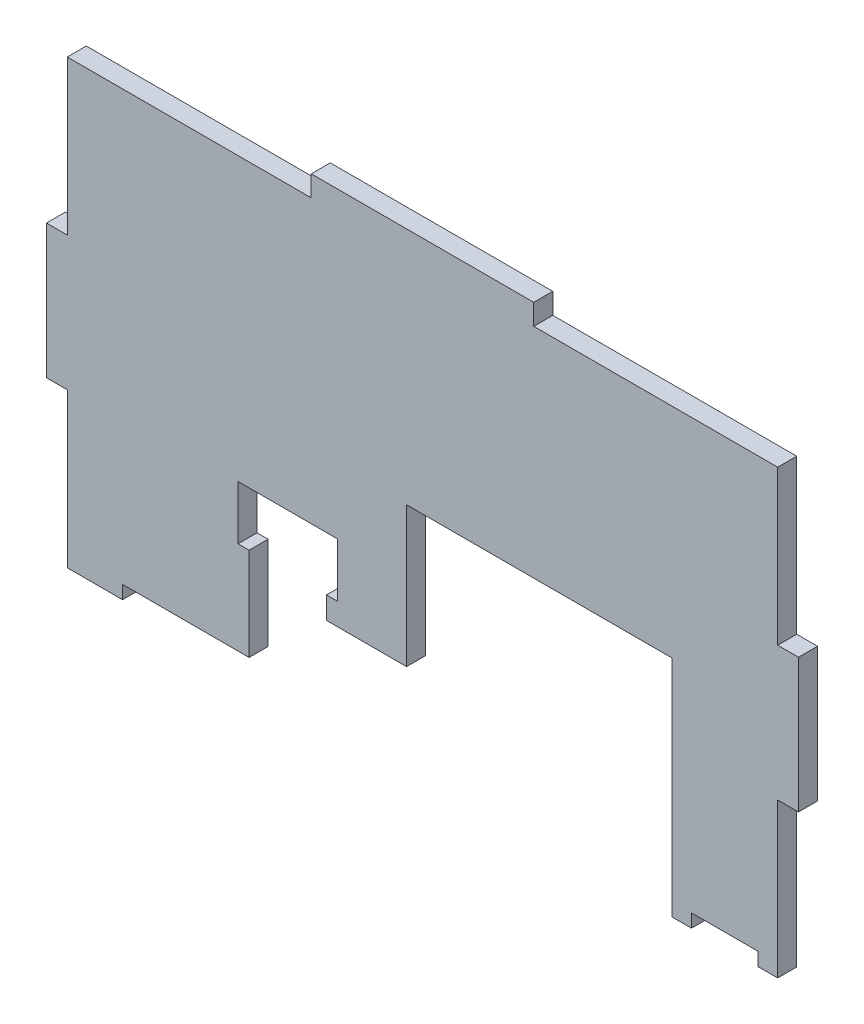
ISO-10303-21;
HEADER;
FILE_DESCRIPTION(('STEP AP214'),'2;1');
FILE_NAME('part.step','',(''),(''),'','','');
FILE_SCHEMA(('AUTOMOTIVE_DESIGN { 1 0 10303 214 1 1 1 1 }'));
ENDSEC;
DATA;
#1=APPLICATION_CONTEXT('core data for automotive mechanical design processes');
#2=APPLICATION_PROTOCOL_DEFINITION('international standard','automotive_design',2000,#1);
#3=PRODUCT_CONTEXT('',#1,'mechanical');
#4=PRODUCT('Part','Part','',(#3));
#5=PRODUCT_RELATED_PRODUCT_CATEGORY('part','',(#4));
#6=PRODUCT_DEFINITION_FORMATION('','',#4);
#7=PRODUCT_DEFINITION_CONTEXT('part definition',#1,'design');
#8=PRODUCT_DEFINITION('design','',#6,#7);
#9=PRODUCT_DEFINITION_SHAPE('','',#8);
#10=(LENGTH_UNIT() NAMED_UNIT(*) SI_UNIT(.MILLI.,.METRE.));
#11=(NAMED_UNIT(*) PLANE_ANGLE_UNIT() SI_UNIT($,.RADIAN.));
#12=(NAMED_UNIT(*) SI_UNIT($,.STERADIAN.) SOLID_ANGLE_UNIT());
#13=UNCERTAINTY_MEASURE_WITH_UNIT(LENGTH_MEASURE(1.E-05),#10,'distance_accuracy_value','');
#14=(GEOMETRIC_REPRESENTATION_CONTEXT(3) GLOBAL_UNCERTAINTY_ASSIGNED_CONTEXT((#13)) GLOBAL_UNIT_ASSIGNED_CONTEXT((#10,
#11,#12)) REPRESENTATION_CONTEXT('',''));
#15=CARTESIAN_POINT('',(0.,0.,0.));
#16=DIRECTION('',(0.,0.,1.));
#17=DIRECTION('',(1.,0.,0.));
#18=AXIS2_PLACEMENT_3D('',#15,#16,#17);
#19=CARTESIAN_POINT('',(0.,3.,4.3));
#20=DIRECTION('',(0.,1.,0.));
#21=DIRECTION('',(-1.,0.,0.));
#22=AXIS2_PLACEMENT_3D('',#19,#20,#21);
#23=PLANE('',#22);
#24=DIRECTION('',(1.,0.,0.));
#25=VECTOR('',#24,1.);
#26=CARTESIAN_POINT('',(0.,3.,0.));
#27=LINE('',#26,#25);
#28=CARTESIAN_POINT('',(12.5,3.,0.));
#29=VERTEX_POINT('',#28);
#30=CARTESIAN_POINT('',(41.0999999999999,3.,0.));
#31=VERTEX_POINT('',#30);
#32=EDGE_CURVE('E300',#29,#31,#27,.T.);
#33=ORIENTED_EDGE('',*,*,#32,.T.);
#34=DIRECTION('',(0.,0.,-1.));
#35=VECTOR('',#34,1.);
#36=CARTESIAN_POINT('',(41.0999999999999,3.,4.3));
#37=LINE('',#36,#35);
#38=CARTESIAN_POINT('',(41.0999999999999,3.,4.3));
#39=VERTEX_POINT('',#38);
#40=EDGE_CURVE('E11',#39,#31,#37,.T.);
#41=ORIENTED_EDGE('',*,*,#40,.F.);
#42=DIRECTION('',(1.,0.,0.));
#43=VECTOR('',#42,1.);
#44=CARTESIAN_POINT('',(0.,3.,4.3));
#45=LINE('',#44,#43);
#46=CARTESIAN_POINT('',(12.5,3.,4.3));
#47=VERTEX_POINT('',#46);
#48=EDGE_CURVE('E175',#47,#39,#45,.T.);
#49=ORIENTED_EDGE('',*,*,#48,.F.);
#50=DIRECTION('',(0.,0.,-1.));
#51=VECTOR('',#50,1.);
#52=CARTESIAN_POINT('',(12.5,3.,4.3));
#53=LINE('',#52,#51);
#54=EDGE_CURVE('E299',#47,#29,#53,.T.);
#55=ORIENTED_EDGE('',*,*,#54,.T.);
#56=EDGE_LOOP('',(#33,#41,#49,#55));
#57=FACE_BOUND('',#56,.T.);
#58=ADVANCED_FACE('F41',(#57),#23,.F.);
#59=CARTESIAN_POINT('',(41.0999999999999,0.,4.3));
#60=DIRECTION('',(1.,0.,0.));
#61=DIRECTION('',(0.,0.,-1.));
#62=AXIS2_PLACEMENT_3D('',#59,#60,#61);
#63=PLANE('',#62);
#64=DIRECTION('',(0.,-1.,0.));
#65=VECTOR('',#64,1.);
#66=CARTESIAN_POINT('',(41.0999999999999,0.,0.));
#67=LINE('',#66,#65);
#68=CARTESIAN_POINT('',(41.0999999999999,24.,0.));
#69=VERTEX_POINT('',#68);
#70=EDGE_CURVE('E304',#69,#31,#67,.T.);
#71=ORIENTED_EDGE('',*,*,#70,.F.);
#72=DIRECTION('',(0.,0.,-1.));
#73=VECTOR('',#72,1.);
#74=CARTESIAN_POINT('',(41.0999999999999,24.,4.3));
#75=LINE('',#74,#73);
#76=CARTESIAN_POINT('',(41.0999999999999,24.,4.3));
#77=VERTEX_POINT('',#76);
#78=EDGE_CURVE('E50',#77,#69,#75,.T.);
#79=ORIENTED_EDGE('',*,*,#78,.F.);
#80=DIRECTION('',(0.,-1.,0.));
#81=VECTOR('',#80,1.);
#82=CARTESIAN_POINT('',(41.0999999999999,0.,4.3));
#83=LINE('',#82,#81);
#84=EDGE_CURVE('E1045',#77,#39,#83,.T.);
#85=ORIENTED_EDGE('',*,*,#84,.T.);
#86=ORIENTED_EDGE('',*,*,#40,.T.);
#87=EDGE_LOOP('',(#71,#79,#85,#86));
#88=FACE_BOUND('',#87,.T.);
#89=ADVANCED_FACE('F529',(#88),#63,.T.);
#90=CARTESIAN_POINT('',(0.,24.,4.3));
#91=DIRECTION('',(0.,1.,0.));
#92=DIRECTION('',(0.,0.,1.));
#93=AXIS2_PLACEMENT_3D('',#90,#91,#92);
#94=PLANE('',#93);
#95=DIRECTION('',(1.,0.,0.));
#96=VECTOR('',#95,1.);
#97=CARTESIAN_POINT('',(0.,24.,0.));
#98=LINE('',#97,#96);
#99=CARTESIAN_POINT('',(38.5999999999999,24.,0.));
#100=VERTEX_POINT('',#99);
#101=EDGE_CURVE('E308',#100,#69,#98,.T.);
#102=ORIENTED_EDGE('',*,*,#101,.F.);
#103=DIRECTION('',(0.,0.,-1.));
#104=VECTOR('',#103,1.);
#105=CARTESIAN_POINT('',(38.5999999999999,24.,4.3));
#106=LINE('',#105,#104);
#107=CARTESIAN_POINT('',(38.5999999999999,24.,4.3));
#108=VERTEX_POINT('',#107);
#109=EDGE_CURVE('E517',#108,#100,#106,.T.);
#110=ORIENTED_EDGE('',*,*,#109,.F.);
#111=DIRECTION('',(1.,0.,0.));
#112=VECTOR('',#111,1.);
#113=CARTESIAN_POINT('',(0.,24.,4.3));
#114=LINE('',#113,#112);
#115=EDGE_CURVE('E526',#108,#77,#114,.T.);
#116=ORIENTED_EDGE('',*,*,#115,.T.);
#117=ORIENTED_EDGE('',*,*,#78,.T.);
#118=EDGE_LOOP('',(#102,#110,#116,#117));
#119=FACE_BOUND('',#118,.T.);
#120=ADVANCED_FACE('F524',(#119),#94,.T.);
#121=CARTESIAN_POINT('',(38.5999999999999,0.,4.3));
#122=DIRECTION('',(-1.,0.,0.));
#123=DIRECTION('',(0.,0.,1.));
#124=AXIS2_PLACEMENT_3D('',#121,#122,#123);
#125=PLANE('',#124);
#126=DIRECTION('',(0.,1.,0.));
#127=VECTOR('',#126,1.);
#128=CARTESIAN_POINT('',(38.5999999999999,0.,0.));
#129=LINE('',#128,#127);
#130=CARTESIAN_POINT('',(38.5999999999999,36.2,0.));
#131=VERTEX_POINT('',#130);
#132=EDGE_CURVE('E312',#100,#131,#129,.T.);
#133=ORIENTED_EDGE('',*,*,#132,.T.);
#134=DIRECTION('',(0.,0.,-1.));
#135=VECTOR('',#134,1.);
#136=CARTESIAN_POINT('',(38.5999999999999,36.2,4.3));
#137=LINE('',#136,#135);
#138=CARTESIAN_POINT('',(38.5999999999999,36.2,4.3));
#139=VERTEX_POINT('',#138);
#140=EDGE_CURVE('E513',#139,#131,#137,.T.);
#141=ORIENTED_EDGE('',*,*,#140,.F.);
#142=DIRECTION('',(0.,1.,0.));
#143=VECTOR('',#142,1.);
#144=CARTESIAN_POINT('',(38.5999999999999,0.,4.3));
#145=LINE('',#144,#143);
#146=EDGE_CURVE('E548',#108,#139,#145,.T.);
#147=ORIENTED_EDGE('',*,*,#146,.F.);
#148=ORIENTED_EDGE('',*,*,#109,.T.);
#149=EDGE_LOOP('',(#133,#141,#147,#148));
#150=FACE_BOUND('',#149,.T.);
#151=ADVANCED_FACE('F537',(#150),#125,.F.);
#152=CARTESIAN_POINT('',(0.,36.2,4.3));
#153=DIRECTION('',(0.,1.,0.));
#154=DIRECTION('',(0.,0.,1.));
#155=AXIS2_PLACEMENT_3D('',#152,#153,#154);
#156=PLANE('',#155);
#157=DIRECTION('',(1.,0.,0.));
#158=VECTOR('',#157,1.);
#159=CARTESIAN_POINT('',(0.,36.2,0.));
#160=LINE('',#159,#158);
#161=CARTESIAN_POINT('',(61.0999999999999,36.2,0.));
#162=VERTEX_POINT('',#161);
#163=EDGE_CURVE('E315',#131,#162,#160,.T.);
#164=ORIENTED_EDGE('',*,*,#163,.T.);
#165=DIRECTION('',(0.,0.,-1.));
#166=VECTOR('',#165,1.);
#167=CARTESIAN_POINT('',(61.0999999999999,36.2,4.3));
#168=LINE('',#167,#166);
#169=CARTESIAN_POINT('',(61.0999999999999,36.2,4.3));
#170=VERTEX_POINT('',#169);
#171=EDGE_CURVE('E510',#170,#162,#168,.T.);
#172=ORIENTED_EDGE('',*,*,#171,.F.);
#173=DIRECTION('',(1.,0.,0.));
#174=VECTOR('',#173,1.);
#175=CARTESIAN_POINT('',(0.,36.2,4.3));
#176=LINE('',#175,#174);
#177=EDGE_CURVE('E543',#139,#170,#176,.T.);
#178=ORIENTED_EDGE('',*,*,#177,.F.);
#179=ORIENTED_EDGE('',*,*,#140,.T.);
#180=EDGE_LOOP('',(#164,#172,#178,#179));
#181=FACE_BOUND('',#180,.T.);
#182=ADVANCED_FACE('F541',(#181),#156,.F.);
#183=CARTESIAN_POINT('',(61.0999999999999,0.,4.3));
#184=DIRECTION('',(-1.,0.,0.));
#185=DIRECTION('',(0.,0.,1.));
#186=AXIS2_PLACEMENT_3D('',#183,#184,#185);
#187=PLANE('',#186);
#188=DIRECTION('',(0.,1.,0.));
#189=VECTOR('',#188,1.);
#190=CARTESIAN_POINT('',(61.0999999999999,0.,0.));
#191=LINE('',#190,#189);
#192=CARTESIAN_POINT('',(61.0999999999999,24.,0.));
#193=VERTEX_POINT('',#192);
#194=EDGE_CURVE('E319',#193,#162,#191,.T.);
#195=ORIENTED_EDGE('',*,*,#194,.F.);
#196=DIRECTION('',(0.,0.,-1.));
#197=VECTOR('',#196,1.);
#198=CARTESIAN_POINT('',(61.0999999999999,24.,4.3));
#199=LINE('',#198,#197);
#200=CARTESIAN_POINT('',(61.0999999999999,24.,4.3));
#201=VERTEX_POINT('',#200);
#202=EDGE_CURVE('E507',#201,#193,#199,.T.);
#203=ORIENTED_EDGE('',*,*,#202,.F.);
#204=DIRECTION('',(0.,1.,0.));
#205=VECTOR('',#204,1.);
#206=CARTESIAN_POINT('',(61.0999999999999,0.,4.3));
#207=LINE('',#206,#205);
#208=EDGE_CURVE('E547',#201,#170,#207,.T.);
#209=ORIENTED_EDGE('',*,*,#208,.T.);
#210=ORIENTED_EDGE('',*,*,#171,.T.);
#211=EDGE_LOOP('',(#195,#203,#209,#210));
#212=FACE_BOUND('',#211,.T.);
#213=ADVANCED_FACE('F934',(#212),#187,.T.);
#214=CARTESIAN_POINT('',(0.,24.,4.3));
#215=DIRECTION('',(0.,-1.,0.));
#216=DIRECTION('',(0.,0.,-1.));
#217=AXIS2_PLACEMENT_3D('',#214,#215,#216);
#218=PLANE('',#217);
#219=DIRECTION('',(-1.,0.,0.));
#220=VECTOR('',#219,1.);
#221=CARTESIAN_POINT('',(0.,24.,0.));
#222=LINE('',#221,#220);
#223=CARTESIAN_POINT('',(58.5999999999999,24.,0.));
#224=VERTEX_POINT('',#223);
#225=EDGE_CURVE('E323',#193,#224,#222,.T.);
#226=ORIENTED_EDGE('',*,*,#225,.T.);
#227=DIRECTION('',(0.,0.,-1.));
#228=VECTOR('',#227,1.);
#229=CARTESIAN_POINT('',(58.5999999999999,24.,4.3));
#230=LINE('',#229,#228);
#231=CARTESIAN_POINT('',(58.5999999999999,24.,4.3));
#232=VERTEX_POINT('',#231);
#233=EDGE_CURVE('E503',#232,#224,#230,.T.);
#234=ORIENTED_EDGE('',*,*,#233,.F.);
#235=DIRECTION('',(-1.,0.,0.));
#236=VECTOR('',#235,1.);
#237=CARTESIAN_POINT('',(0.,24.,4.3));
#238=LINE('',#237,#236);
#239=EDGE_CURVE('E552',#201,#232,#238,.T.);
#240=ORIENTED_EDGE('',*,*,#239,.F.);
#241=ORIENTED_EDGE('',*,*,#202,.T.);
#242=EDGE_LOOP('',(#226,#234,#240,#241));
#243=FACE_BOUND('',#242,.T.);
#244=ADVANCED_FACE('F924',(#243),#218,.F.);
#245=CARTESIAN_POINT('',(58.5999999999999,0.,4.3));
#246=DIRECTION('',(1.,0.,0.));
#247=DIRECTION('',(0.,0.,-1.));
#248=AXIS2_PLACEMENT_3D('',#245,#246,#247);
#249=PLANE('',#248);
#250=DIRECTION('',(0.,-1.,0.));
#251=VECTOR('',#250,1.);
#252=CARTESIAN_POINT('',(58.5999999999999,0.,0.));
#253=LINE('',#252,#251);
#254=CARTESIAN_POINT('',(58.5999999999999,19.,0.));
#255=VERTEX_POINT('',#254);
#256=EDGE_CURVE('E326',#224,#255,#253,.T.);
#257=ORIENTED_EDGE('',*,*,#256,.T.);
#258=DIRECTION('',(0.,0.,-1.));
#259=VECTOR('',#258,1.);
#260=CARTESIAN_POINT('',(58.5999999999999,19.,4.3));
#261=LINE('',#260,#259);
#262=CARTESIAN_POINT('',(58.5999999999999,19.,4.3));
#263=VERTEX_POINT('',#262);
#264=EDGE_CURVE('E500',#263,#255,#261,.T.);
#265=ORIENTED_EDGE('',*,*,#264,.F.);
#266=DIRECTION('',(0.,-1.,0.));
#267=VECTOR('',#266,1.);
#268=CARTESIAN_POINT('',(58.5999999999999,0.,4.3));
#269=LINE('',#268,#267);
#270=EDGE_CURVE('E559',#232,#263,#269,.T.);
#271=ORIENTED_EDGE('',*,*,#270,.F.);
#272=ORIENTED_EDGE('',*,*,#233,.T.);
#273=EDGE_LOOP('',(#257,#265,#271,#272));
#274=FACE_BOUND('',#273,.T.);
#275=ADVANCED_FACE('F913',(#274),#249,.F.);
#276=CARTESIAN_POINT('',(0.,19.,4.3));
#277=DIRECTION('',(0.,-1.,0.));
#278=DIRECTION('',(0.,0.,-1.));
#279=AXIS2_PLACEMENT_3D('',#276,#277,#278);
#280=PLANE('',#279);
#281=DIRECTION('',(-1.,0.,0.));
#282=VECTOR('',#281,1.);
#283=CARTESIAN_POINT('',(0.,19.,0.));
#284=LINE('',#283,#282);
#285=CARTESIAN_POINT('',(76.6999999999999,19.,0.));
#286=VERTEX_POINT('',#285);
#287=EDGE_CURVE('E330',#286,#255,#284,.T.);
#288=ORIENTED_EDGE('',*,*,#287,.F.);
#289=DIRECTION('',(0.,0.,-1.));
#290=VECTOR('',#289,1.);
#291=CARTESIAN_POINT('',(76.6999999999999,19.,4.3));
#292=LINE('',#291,#290);
#293=CARTESIAN_POINT('',(76.6999999999999,19.,4.3));
#294=VERTEX_POINT('',#293);
#295=EDGE_CURVE('E497',#294,#286,#292,.T.);
#296=ORIENTED_EDGE('',*,*,#295,.F.);
#297=DIRECTION('',(-1.,0.,0.));
#298=VECTOR('',#297,1.);
#299=CARTESIAN_POINT('',(0.,19.,4.3));
#300=LINE('',#299,#298);
#301=EDGE_CURVE('E562',#294,#263,#300,.T.);
#302=ORIENTED_EDGE('',*,*,#301,.T.);
#303=ORIENTED_EDGE('',*,*,#264,.T.);
#304=EDGE_LOOP('',(#288,#296,#302,#303));
#305=FACE_BOUND('',#304,.T.);
#306=ADVANCED_FACE('F903',(#305),#280,.T.);
#307=CARTESIAN_POINT('',(76.6999999999999,0.,4.3));
#308=DIRECTION('',(-1.,0.,0.));
#309=DIRECTION('',(0.,0.,1.));
#310=AXIS2_PLACEMENT_3D('',#307,#308,#309);
#311=PLANE('',#310);
#312=DIRECTION('',(0.,1.,0.));
#313=VECTOR('',#312,1.);
#314=CARTESIAN_POINT('',(76.6999999999999,0.,0.));
#315=LINE('',#314,#313);
#316=CARTESIAN_POINT('',(76.6999999999999,50.7,0.));
#317=VERTEX_POINT('',#316);
#318=EDGE_CURVE('E334',#286,#317,#315,.T.);
#319=ORIENTED_EDGE('',*,*,#318,.T.);
#320=DIRECTION('',(0.,0.,-1.));
#321=VECTOR('',#320,1.);
#322=CARTESIAN_POINT('',(76.6999999999999,50.7,4.3));
#323=LINE('',#322,#321);
#324=CARTESIAN_POINT('',(76.6999999999999,50.7,4.3));
#325=VERTEX_POINT('',#324);
#326=EDGE_CURVE('E493',#325,#317,#323,.T.);
#327=ORIENTED_EDGE('',*,*,#326,.F.);
#328=DIRECTION('',(0.,1.,0.));
#329=VECTOR('',#328,1.);
#330=CARTESIAN_POINT('',(76.6999999999999,0.,4.3));
#331=LINE('',#330,#329);
#332=EDGE_CURVE('E566',#294,#325,#331,.T.);
#333=ORIENTED_EDGE('',*,*,#332,.F.);
#334=ORIENTED_EDGE('',*,*,#295,.T.);
#335=EDGE_LOOP('',(#319,#327,#333,#334));
#336=FACE_BOUND('',#335,.T.);
#337=ADVANCED_FACE('F893',(#336),#311,.F.);
#338=CARTESIAN_POINT('',(0.,50.7,4.3));
#339=DIRECTION('',(0.,1.,0.));
#340=DIRECTION('',(0.,0.,1.));
#341=AXIS2_PLACEMENT_3D('',#338,#339,#340);
#342=PLANE('',#341);
#343=DIRECTION('',(1.,0.,0.));
#344=VECTOR('',#343,1.);
#345=CARTESIAN_POINT('',(0.,50.7,0.));
#346=LINE('',#345,#344);
#347=CARTESIAN_POINT('',(136.7,50.7,0.));
#348=VERTEX_POINT('',#347);
#349=EDGE_CURVE('E337',#317,#348,#346,.T.);
#350=ORIENTED_EDGE('',*,*,#349,.T.);
#351=DIRECTION('',(0.,0.,-1.));
#352=VECTOR('',#351,1.);
#353=CARTESIAN_POINT('',(136.7,50.7,4.3));
#354=LINE('',#353,#352);
#355=CARTESIAN_POINT('',(136.7,50.7,4.3));
#356=VERTEX_POINT('',#355);
#357=EDGE_CURVE('E490',#356,#348,#354,.T.);
#358=ORIENTED_EDGE('',*,*,#357,.F.);
#359=DIRECTION('',(1.,0.,0.));
#360=VECTOR('',#359,1.);
#361=CARTESIAN_POINT('',(0.,50.7,4.3));
#362=LINE('',#361,#360);
#363=EDGE_CURVE('E569',#325,#356,#362,.T.);
#364=ORIENTED_EDGE('',*,*,#363,.F.);
#365=ORIENTED_EDGE('',*,*,#326,.T.);
#366=EDGE_LOOP('',(#350,#358,#364,#365));
#367=FACE_BOUND('',#366,.T.);
#368=ADVANCED_FACE('F883',(#367),#342,.F.);
#369=CARTESIAN_POINT('',(136.7,0.,4.3));
#370=DIRECTION('',(-1.,0.,0.));
#371=DIRECTION('',(0.,0.,1.));
#372=AXIS2_PLACEMENT_3D('',#369,#370,#371);
#373=PLANE('',#372);
#374=DIRECTION('',(0.,1.,0.));
#375=VECTOR('',#374,1.);
#376=CARTESIAN_POINT('',(136.7,0.,0.));
#377=LINE('',#376,#375);
#378=CARTESIAN_POINT('',(136.7,0.,0.));
#379=VERTEX_POINT('',#378);
#380=EDGE_CURVE('E341',#379,#348,#377,.T.);
#381=ORIENTED_EDGE('',*,*,#380,.F.);
#382=DIRECTION('',(0.,0.,-1.));
#383=VECTOR('',#382,1.);
#384=CARTESIAN_POINT('',(136.7,0.,4.3));
#385=LINE('',#384,#383);
#386=CARTESIAN_POINT('',(136.7,0.,4.3));
#387=VERTEX_POINT('',#386);
#388=EDGE_CURVE('E487',#387,#379,#385,.T.);
#389=ORIENTED_EDGE('',*,*,#388,.F.);
#390=DIRECTION('',(0.,1.,0.));
#391=VECTOR('',#390,1.);
#392=CARTESIAN_POINT('',(136.7,0.,4.3));
#393=LINE('',#392,#391);
#394=EDGE_CURVE('E572',#387,#356,#393,.T.);
#395=ORIENTED_EDGE('',*,*,#394,.T.);
#396=ORIENTED_EDGE('',*,*,#357,.T.);
#397=EDGE_LOOP('',(#381,#389,#395,#396));
#398=FACE_BOUND('',#397,.T.);
#399=ADVANCED_FACE('F873',(#398),#373,.T.);
#400=CARTESIAN_POINT('',(0.,0.,4.3));
#401=DIRECTION('',(0.,1.,0.));
#402=DIRECTION('',(-1.,0.,0.));
#403=AXIS2_PLACEMENT_3D('',#400,#401,#402);
#404=PLANE('',#403);
#405=DIRECTION('',(1.,0.,0.));
#406=VECTOR('',#405,1.);
#407=CARTESIAN_POINT('',(0.,0.,0.));
#408=LINE('',#407,#406);
#409=CARTESIAN_POINT('',(141.1,0.,0.));
#410=VERTEX_POINT('',#409);
#411=EDGE_CURVE('E345',#379,#410,#408,.T.);
#412=ORIENTED_EDGE('',*,*,#411,.T.);
#413=DIRECTION('',(0.,0.,-1.));
#414=VECTOR('',#413,1.);
#415=CARTESIAN_POINT('',(141.1,0.,4.3));
#416=LINE('',#415,#414);
#417=CARTESIAN_POINT('',(141.1,0.,4.3));
#418=VERTEX_POINT('',#417);
#419=EDGE_CURVE('E483',#418,#410,#416,.T.);
#420=ORIENTED_EDGE('',*,*,#419,.F.);
#421=DIRECTION('',(1.,0.,0.));
#422=VECTOR('',#421,1.);
#423=CARTESIAN_POINT('',(0.,0.,4.3));
#424=LINE('',#423,#422);
#425=EDGE_CURVE('E576',#387,#418,#424,.T.);
#426=ORIENTED_EDGE('',*,*,#425,.F.);
#427=ORIENTED_EDGE('',*,*,#388,.T.);
#428=EDGE_LOOP('',(#412,#420,#426,#427));
#429=FACE_BOUND('',#428,.T.);
#430=ADVANCED_FACE('F863',(#429),#404,.F.);
#431=CARTESIAN_POINT('',(141.1,0.,4.3));
#432=DIRECTION('',(-1.,0.,0.));
#433=DIRECTION('',(0.,0.,1.));
#434=AXIS2_PLACEMENT_3D('',#431,#432,#433);
#435=PLANE('',#434);
#436=DIRECTION('',(0.,1.,0.));
#437=VECTOR('',#436,1.);
#438=CARTESIAN_POINT('',(141.1,0.,0.));
#439=LINE('',#438,#437);
#440=CARTESIAN_POINT('',(141.1,3.,0.));
#441=VERTEX_POINT('',#440);
#442=EDGE_CURVE('E348',#410,#441,#439,.T.);
#443=ORIENTED_EDGE('',*,*,#442,.T.);
#444=DIRECTION('',(0.,0.,-1.));
#445=VECTOR('',#444,1.);
#446=CARTESIAN_POINT('',(141.1,3.,4.3));
#447=LINE('',#446,#445);
#448=CARTESIAN_POINT('',(141.1,3.,4.3));
#449=VERTEX_POINT('',#448);
#450=EDGE_CURVE('E479',#449,#441,#447,.T.);
#451=ORIENTED_EDGE('',*,*,#450,.F.);
#452=DIRECTION('',(0.,1.,0.));
#453=VECTOR('',#452,1.);
#454=CARTESIAN_POINT('',(141.1,0.,4.3));
#455=LINE('',#454,#453);
#456=EDGE_CURVE('E579',#418,#449,#455,.T.);
#457=ORIENTED_EDGE('',*,*,#456,.F.);
#458=ORIENTED_EDGE('',*,*,#419,.T.);
#459=EDGE_LOOP('',(#443,#451,#457,#458));
#460=FACE_BOUND('',#459,.T.);
#461=ADVANCED_FACE('F853',(#460),#435,.F.);
#462=CARTESIAN_POINT('',(0.,3.,4.3));
#463=DIRECTION('',(0.,1.,0.));
#464=DIRECTION('',(0.,0.,1.));
#465=AXIS2_PLACEMENT_3D('',#462,#463,#464);
#466=PLANE('',#465);
#467=DIRECTION('',(1.,0.,0.));
#468=VECTOR('',#467,1.);
#469=CARTESIAN_POINT('',(0.,3.,0.));
#470=LINE('',#469,#468);
#471=CARTESIAN_POINT('',(156.1,3.,0.));
#472=VERTEX_POINT('',#471);
#473=EDGE_CURVE('E351',#441,#472,#470,.T.);
#474=ORIENTED_EDGE('',*,*,#473,.T.);
#475=DIRECTION('',(0.,0.,-1.));
#476=VECTOR('',#475,1.);
#477=CARTESIAN_POINT('',(156.1,3.,4.3));
#478=LINE('',#477,#476);
#479=CARTESIAN_POINT('',(156.1,3.,4.3));
#480=VERTEX_POINT('',#479);
#481=EDGE_CURVE('E476',#480,#472,#478,.T.);
#482=ORIENTED_EDGE('',*,*,#481,.F.);
#483=DIRECTION('',(1.,0.,0.));
#484=VECTOR('',#483,1.);
#485=CARTESIAN_POINT('',(0.,3.,4.3));
#486=LINE('',#485,#484);
#487=EDGE_CURVE('E582',#449,#480,#486,.T.);
#488=ORIENTED_EDGE('',*,*,#487,.F.);
#489=ORIENTED_EDGE('',*,*,#450,.T.);
#490=EDGE_LOOP('',(#474,#482,#488,#489));
#491=FACE_BOUND('',#490,.T.);
#492=ADVANCED_FACE('F843',(#491),#466,.F.);
#493=CARTESIAN_POINT('',(156.1,0.,4.3));
#494=DIRECTION('',(-1.,0.,0.));
#495=DIRECTION('',(0.,0.,1.));
#496=AXIS2_PLACEMENT_3D('',#493,#494,#495);
#497=PLANE('',#496);
#498=DIRECTION('',(0.,1.,0.));
#499=VECTOR('',#498,1.);
#500=CARTESIAN_POINT('',(156.1,0.,0.));
#501=LINE('',#500,#499);
#502=CARTESIAN_POINT('',(156.1,0.,0.));
#503=VERTEX_POINT('',#502);
#504=EDGE_CURVE('E355',#503,#472,#501,.T.);
#505=ORIENTED_EDGE('',*,*,#504,.F.);
#506=DIRECTION('',(0.,0.,-1.));
#507=VECTOR('',#506,1.);
#508=CARTESIAN_POINT('',(156.1,0.,4.3));
#509=LINE('',#508,#507);
#510=CARTESIAN_POINT('',(156.1,0.,4.3));
#511=VERTEX_POINT('',#510);
#512=EDGE_CURVE('E473',#511,#503,#509,.T.);
#513=ORIENTED_EDGE('',*,*,#512,.F.);
#514=DIRECTION('',(0.,1.,0.));
#515=VECTOR('',#514,1.);
#516=CARTESIAN_POINT('',(156.1,0.,4.3));
#517=LINE('',#516,#515);
#518=EDGE_CURVE('E585',#511,#480,#517,.T.);
#519=ORIENTED_EDGE('',*,*,#518,.T.);
#520=ORIENTED_EDGE('',*,*,#481,.T.);
#521=EDGE_LOOP('',(#505,#513,#519,#520));
#522=FACE_BOUND('',#521,.T.);
#523=ADVANCED_FACE('F833',(#522),#497,.T.);
#524=CARTESIAN_POINT('',(0.,0.,4.3));
#525=DIRECTION('',(0.,1.,0.));
#526=DIRECTION('',(0.,0.,1.));
#527=AXIS2_PLACEMENT_3D('',#524,#525,#526);
#528=PLANE('',#527);
#529=DIRECTION('',(1.,0.,0.));
#530=VECTOR('',#529,1.);
#531=CARTESIAN_POINT('',(0.,0.,0.));
#532=LINE('',#531,#530);
#533=CARTESIAN_POINT('',(160.6,0.,0.));
#534=VERTEX_POINT('',#533);
#535=EDGE_CURVE('E359',#503,#534,#532,.T.);
#536=ORIENTED_EDGE('',*,*,#535,.T.);
#537=DIRECTION('',(0.,0.,-1.));
#538=VECTOR('',#537,1.);
#539=CARTESIAN_POINT('',(160.6,0.,4.3));
#540=LINE('',#539,#538);
#541=CARTESIAN_POINT('',(160.6,0.,4.3));
#542=VERTEX_POINT('',#541);
#543=EDGE_CURVE('E469',#542,#534,#540,.T.);
#544=ORIENTED_EDGE('',*,*,#543,.F.);
#545=DIRECTION('',(1.,0.,0.));
#546=VECTOR('',#545,1.);
#547=CARTESIAN_POINT('',(0.,0.,4.3));
#548=LINE('',#547,#546);
#549=EDGE_CURVE('E589',#511,#542,#548,.T.);
#550=ORIENTED_EDGE('',*,*,#549,.F.);
#551=ORIENTED_EDGE('',*,*,#512,.T.);
#552=EDGE_LOOP('',(#536,#544,#550,#551));
#553=FACE_BOUND('',#552,.T.);
#554=ADVANCED_FACE('F823',(#553),#528,.F.);
#555=CARTESIAN_POINT('',(160.6,2.55813224899283E-13,4.3));
#556=DIRECTION('',(-1.,0.,0.));
#557=DIRECTION('',(0.,-1.,0.));
#558=AXIS2_PLACEMENT_3D('',#555,#556,#557);
#559=PLANE('',#558);
#560=DIRECTION('',(0.,1.,0.));
#561=VECTOR('',#560,1.);
#562=CARTESIAN_POINT('',(160.6,2.55813224899283E-13,0.));
#563=LINE('',#562,#561);
#564=CARTESIAN_POINT('',(160.6,34.85,0.));
#565=VERTEX_POINT('',#564);
#566=EDGE_CURVE('E362',#534,#565,#563,.T.);
#567=ORIENTED_EDGE('',*,*,#566,.T.);
#568=DIRECTION('',(0.,0.,-1.));
#569=VECTOR('',#568,1.);
#570=CARTESIAN_POINT('',(160.6,34.85,4.3));
#571=LINE('',#570,#569);
#572=CARTESIAN_POINT('',(160.6,34.85,4.3));
#573=VERTEX_POINT('',#572);
#574=EDGE_CURVE('E465',#573,#565,#571,.T.);
#575=ORIENTED_EDGE('',*,*,#574,.F.);
#576=DIRECTION('',(0.,1.,0.));
#577=VECTOR('',#576,1.);
#578=CARTESIAN_POINT('',(160.6,2.55813224899283E-13,4.3));
#579=LINE('',#578,#577);
#580=EDGE_CURVE('E592',#542,#573,#579,.T.);
#581=ORIENTED_EDGE('',*,*,#580,.F.);
#582=ORIENTED_EDGE('',*,*,#543,.T.);
#583=EDGE_LOOP('',(#567,#575,#581,#582));
#584=FACE_BOUND('',#583,.T.);
#585=ADVANCED_FACE('F813',(#584),#559,.F.);
#586=CARTESIAN_POINT('',(0.,34.8500000000003,4.3));
#587=DIRECTION('',(0.,1.,0.));
#588=DIRECTION('',(-1.,0.,0.));
#589=AXIS2_PLACEMENT_3D('',#586,#587,#588);
#590=PLANE('',#589);
#591=DIRECTION('',(1.,0.,0.));
#592=VECTOR('',#591,1.);
#593=CARTESIAN_POINT('',(0.,34.8500000000003,0.));
#594=LINE('',#593,#592);
#595=CARTESIAN_POINT('',(165.3,34.85,0.));
#596=VERTEX_POINT('',#595);
#597=EDGE_CURVE('E365',#565,#596,#594,.T.);
#598=ORIENTED_EDGE('',*,*,#597,.T.);
#599=DIRECTION('',(0.,0.,-1.));
#600=VECTOR('',#599,1.);
#601=CARTESIAN_POINT('',(165.3,34.85,4.3));
#602=LINE('',#601,#600);
#603=CARTESIAN_POINT('',(165.3,34.85,4.3));
#604=VERTEX_POINT('',#603);
#605=EDGE_CURVE('E461',#604,#596,#602,.T.);
#606=ORIENTED_EDGE('',*,*,#605,.F.);
#607=DIRECTION('',(1.,0.,0.));
#608=VECTOR('',#607,1.);
#609=CARTESIAN_POINT('',(0.,34.8500000000003,4.3));
#610=LINE('',#609,#608);
#611=EDGE_CURVE('E595',#573,#604,#610,.T.);
#612=ORIENTED_EDGE('',*,*,#611,.F.);
#613=ORIENTED_EDGE('',*,*,#574,.T.);
#614=EDGE_LOOP('',(#598,#606,#612,#613));
#615=FACE_BOUND('',#614,.T.);
#616=ADVANCED_FACE('F803',(#615),#590,.F.);
#617=CARTESIAN_POINT('',(165.3,0.,4.3));
#618=DIRECTION('',(-1.,0.,0.));
#619=DIRECTION('',(0.,0.,1.));
#620=AXIS2_PLACEMENT_3D('',#617,#618,#619);
#621=PLANE('',#620);
#622=DIRECTION('',(0.,1.,0.));
#623=VECTOR('',#622,1.);
#624=CARTESIAN_POINT('',(165.3,0.,0.));
#625=LINE('',#624,#623);
#626=CARTESIAN_POINT('',(165.3,65.15,0.));
#627=VERTEX_POINT('',#626);
#628=EDGE_CURVE('E368',#596,#627,#625,.T.);
#629=ORIENTED_EDGE('',*,*,#628,.T.);
#630=DIRECTION('',(0.,0.,-1.));
#631=VECTOR('',#630,1.);
#632=CARTESIAN_POINT('',(165.3,65.15,4.3));
#633=LINE('',#632,#631);
#634=CARTESIAN_POINT('',(165.3,65.15,4.3));
#635=VERTEX_POINT('',#634);
#636=EDGE_CURVE('E458',#635,#627,#633,.T.);
#637=ORIENTED_EDGE('',*,*,#636,.F.);
#638=DIRECTION('',(0.,1.,0.));
#639=VECTOR('',#638,1.);
#640=CARTESIAN_POINT('',(165.3,0.,4.3));
#641=LINE('',#640,#639);
#642=EDGE_CURVE('E598',#604,#635,#641,.T.);
#643=ORIENTED_EDGE('',*,*,#642,.F.);
#644=ORIENTED_EDGE('',*,*,#605,.T.);
#645=EDGE_LOOP('',(#629,#637,#643,#644));
#646=FACE_BOUND('',#645,.T.);
#647=ADVANCED_FACE('F793',(#646),#621,.F.);
#648=CARTESIAN_POINT('',(0.,65.15,4.3));
#649=DIRECTION('',(0.,1.,0.));
#650=DIRECTION('',(0.,0.,1.));
#651=AXIS2_PLACEMENT_3D('',#648,#649,#650);
#652=PLANE('',#651);
#653=DIRECTION('',(1.,0.,0.));
#654=VECTOR('',#653,1.);
#655=CARTESIAN_POINT('',(0.,65.15,0.));
#656=LINE('',#655,#654);
#657=CARTESIAN_POINT('',(160.6,65.15,0.));
#658=VERTEX_POINT('',#657);
#659=EDGE_CURVE('E372',#658,#627,#656,.T.);
#660=ORIENTED_EDGE('',*,*,#659,.F.);
#661=DIRECTION('',(0.,0.,-1.));
#662=VECTOR('',#661,1.);
#663=CARTESIAN_POINT('',(160.6,65.15,4.3));
#664=LINE('',#663,#662);
#665=CARTESIAN_POINT('',(160.6,65.15,4.3));
#666=VERTEX_POINT('',#665);
#667=EDGE_CURVE('E455',#666,#658,#664,.T.);
#668=ORIENTED_EDGE('',*,*,#667,.F.);
#669=DIRECTION('',(1.,0.,0.));
#670=VECTOR('',#669,1.);
#671=CARTESIAN_POINT('',(0.,65.15,4.3));
#672=LINE('',#671,#670);
#673=EDGE_CURVE('E601',#666,#635,#672,.T.);
#674=ORIENTED_EDGE('',*,*,#673,.T.);
#675=ORIENTED_EDGE('',*,*,#636,.T.);
#676=EDGE_LOOP('',(#660,#668,#674,#675));
#677=FACE_BOUND('',#676,.T.);
#678=ADVANCED_FACE('F783',(#677),#652,.T.);
#679=CARTESIAN_POINT('',(160.6,0.,4.3));
#680=DIRECTION('',(-1.,0.,0.));
#681=DIRECTION('',(0.,0.,1.));
#682=AXIS2_PLACEMENT_3D('',#679,#680,#681);
#683=PLANE('',#682);
#684=DIRECTION('',(0.,1.,0.));
#685=VECTOR('',#684,1.);
#686=CARTESIAN_POINT('',(160.6,0.,0.));
#687=LINE('',#686,#685);
#688=CARTESIAN_POINT('',(160.6,100.,0.));
#689=VERTEX_POINT('',#688);
#690=EDGE_CURVE('E376',#658,#689,#687,.T.);
#691=ORIENTED_EDGE('',*,*,#690,.T.);
#692=DIRECTION('',(0.,0.,-1.));
#693=VECTOR('',#692,1.);
#694=CARTESIAN_POINT('',(160.6,100.,4.3));
#695=LINE('',#694,#693);
#696=CARTESIAN_POINT('',(160.6,100.,4.3));
#697=VERTEX_POINT('',#696);
#698=EDGE_CURVE('E452',#697,#689,#695,.T.);
#699=ORIENTED_EDGE('',*,*,#698,.F.);
#700=DIRECTION('',(0.,1.,0.));
#701=VECTOR('',#700,1.);
#702=CARTESIAN_POINT('',(160.6,0.,4.3));
#703=LINE('',#702,#701);
#704=EDGE_CURVE('E605',#666,#697,#703,.T.);
#705=ORIENTED_EDGE('',*,*,#704,.F.);
#706=ORIENTED_EDGE('',*,*,#667,.T.);
#707=EDGE_LOOP('',(#691,#699,#705,#706));
#708=FACE_BOUND('',#707,.T.);
#709=ADVANCED_FACE('F773',(#708),#683,.F.);
#710=CARTESIAN_POINT('',(0.,100.,4.3));
#711=DIRECTION('',(0.,1.,0.));
#712=DIRECTION('',(-1.,0.,0.));
#713=AXIS2_PLACEMENT_3D('',#710,#711,#712);
#714=PLANE('',#713);
#715=DIRECTION('',(1.,0.,0.));
#716=VECTOR('',#715,1.);
#717=CARTESIAN_POINT('',(0.,100.,0.));
#718=LINE('',#717,#716);
#719=CARTESIAN_POINT('',(105.45,100.,0.));
#720=VERTEX_POINT('',#719);
#721=EDGE_CURVE('E380',#720,#689,#718,.T.);
#722=ORIENTED_EDGE('',*,*,#721,.F.);
#723=DIRECTION('',(0.,0.,-1.));
#724=VECTOR('',#723,1.);
#725=CARTESIAN_POINT('',(105.45,100.,4.3));
#726=LINE('',#725,#724);
#727=CARTESIAN_POINT('',(105.45,100.,4.3));
#728=VERTEX_POINT('',#727);
#729=EDGE_CURVE('E449',#728,#720,#726,.T.);
#730=ORIENTED_EDGE('',*,*,#729,.F.);
#731=DIRECTION('',(1.,0.,0.));
#732=VECTOR('',#731,1.);
#733=CARTESIAN_POINT('',(0.,100.,4.3));
#734=LINE('',#733,#732);
#735=EDGE_CURVE('E608',#728,#697,#734,.T.);
#736=ORIENTED_EDGE('',*,*,#735,.T.);
#737=ORIENTED_EDGE('',*,*,#698,.T.);
#738=EDGE_LOOP('',(#722,#730,#736,#737));
#739=FACE_BOUND('',#738,.T.);
#740=ADVANCED_FACE('F763',(#739),#714,.T.);
#741=CARTESIAN_POINT('',(105.45,0.,4.3));
#742=DIRECTION('',(-1.,0.,0.));
#743=DIRECTION('',(0.,0.,1.));
#744=AXIS2_PLACEMENT_3D('',#741,#742,#743);
#745=PLANE('',#744);
#746=DIRECTION('',(0.,1.,0.));
#747=VECTOR('',#746,1.);
#748=CARTESIAN_POINT('',(105.45,0.,0.));
#749=LINE('',#748,#747);
#750=CARTESIAN_POINT('',(105.45,104.7,0.));
#751=VERTEX_POINT('',#750);
#752=EDGE_CURVE('E384',#720,#751,#749,.T.);
#753=ORIENTED_EDGE('',*,*,#752,.T.);
#754=DIRECTION('',(0.,0.,-1.));
#755=VECTOR('',#754,1.);
#756=CARTESIAN_POINT('',(105.45,104.7,4.3));
#757=LINE('',#756,#755);
#758=CARTESIAN_POINT('',(105.45,104.7,4.3));
#759=VERTEX_POINT('',#758);
#760=EDGE_CURVE('E446',#759,#751,#757,.T.);
#761=ORIENTED_EDGE('',*,*,#760,.F.);
#762=DIRECTION('',(0.,1.,0.));
#763=VECTOR('',#762,1.);
#764=CARTESIAN_POINT('',(105.45,0.,4.3));
#765=LINE('',#764,#763);
#766=EDGE_CURVE('E612',#728,#759,#765,.T.);
#767=ORIENTED_EDGE('',*,*,#766,.F.);
#768=ORIENTED_EDGE('',*,*,#729,.T.);
#769=EDGE_LOOP('',(#753,#761,#767,#768));
#770=FACE_BOUND('',#769,.T.);
#771=ADVANCED_FACE('F753',(#770),#745,.F.);
#772=CARTESIAN_POINT('',(0.,104.7,4.3));
#773=DIRECTION('',(0.,1.,0.));
#774=DIRECTION('',(0.,0.,1.));
#775=AXIS2_PLACEMENT_3D('',#772,#773,#774);
#776=PLANE('',#775);
#777=DIRECTION('',(1.,0.,0.));
#778=VECTOR('',#777,1.);
#779=CARTESIAN_POINT('',(0.,104.7,0.));
#780=LINE('',#779,#778);
#781=CARTESIAN_POINT('',(55.1499999999999,104.7,0.));
#782=VERTEX_POINT('',#781);
#783=EDGE_CURVE('E388',#782,#751,#780,.T.);
#784=ORIENTED_EDGE('',*,*,#783,.F.);
#785=DIRECTION('',(0.,0.,-1.));
#786=VECTOR('',#785,1.);
#787=CARTESIAN_POINT('',(55.1499999999999,104.7,4.3));
#788=LINE('',#787,#786);
#789=CARTESIAN_POINT('',(55.1499999999999,104.7,4.3));
#790=VERTEX_POINT('',#789);
#791=EDGE_CURVE('E443',#790,#782,#788,.T.);
#792=ORIENTED_EDGE('',*,*,#791,.F.);
#793=DIRECTION('',(1.,0.,0.));
#794=VECTOR('',#793,1.);
#795=CARTESIAN_POINT('',(0.,104.7,4.3));
#796=LINE('',#795,#794);
#797=EDGE_CURVE('E615',#790,#759,#796,.T.);
#798=ORIENTED_EDGE('',*,*,#797,.T.);
#799=ORIENTED_EDGE('',*,*,#760,.T.);
#800=EDGE_LOOP('',(#784,#792,#798,#799));
#801=FACE_BOUND('',#800,.T.);
#802=ADVANCED_FACE('F743',(#801),#776,.T.);
#803=CARTESIAN_POINT('',(55.1499999999999,0.,4.3));
#804=DIRECTION('',(-1.,0.,0.));
#805=DIRECTION('',(0.,0.,1.));
#806=AXIS2_PLACEMENT_3D('',#803,#804,#805);
#807=PLANE('',#806);
#808=DIRECTION('',(0.,1.,0.));
#809=VECTOR('',#808,1.);
#810=CARTESIAN_POINT('',(55.1499999999999,0.,0.));
#811=LINE('',#810,#809);
#812=CARTESIAN_POINT('',(55.1499999999999,100.,0.));
#813=VERTEX_POINT('',#812);
#814=EDGE_CURVE('E392',#813,#782,#811,.T.);
#815=ORIENTED_EDGE('',*,*,#814,.F.);
#816=DIRECTION('',(0.,0.,-1.));
#817=VECTOR('',#816,1.);
#818=CARTESIAN_POINT('',(55.1499999999999,100.,4.3));
#819=LINE('',#818,#817);
#820=CARTESIAN_POINT('',(55.1499999999999,100.,4.3));
#821=VERTEX_POINT('',#820);
#822=EDGE_CURVE('E440',#821,#813,#819,.T.);
#823=ORIENTED_EDGE('',*,*,#822,.F.);
#824=DIRECTION('',(0.,1.,0.));
#825=VECTOR('',#824,1.);
#826=CARTESIAN_POINT('',(55.1499999999999,0.,4.3));
#827=LINE('',#826,#825);
#828=EDGE_CURVE('E619',#821,#790,#827,.T.);
#829=ORIENTED_EDGE('',*,*,#828,.T.);
#830=ORIENTED_EDGE('',*,*,#791,.T.);
#831=EDGE_LOOP('',(#815,#823,#829,#830));
#832=FACE_BOUND('',#831,.T.);
#833=ADVANCED_FACE('F733',(#832),#807,.T.);
#834=CARTESIAN_POINT('',(0.,100.,4.3));
#835=DIRECTION('',(0.,1.,0.));
#836=DIRECTION('',(-1.,0.,0.));
#837=AXIS2_PLACEMENT_3D('',#834,#835,#836);
#838=PLANE('',#837);
#839=DIRECTION('',(1.,0.,0.));
#840=VECTOR('',#839,1.);
#841=CARTESIAN_POINT('',(0.,100.,0.));
#842=LINE('',#841,#840);
#843=CARTESIAN_POINT('',(0.,100.,0.));
#844=VERTEX_POINT('',#843);
#845=EDGE_CURVE('E396',#844,#813,#842,.T.);
#846=ORIENTED_EDGE('',*,*,#845,.F.);
#847=DIRECTION('',(0.,0.,-1.));
#848=VECTOR('',#847,1.);
#849=CARTESIAN_POINT('',(0.,100.,4.3));
#850=LINE('',#849,#848);
#851=CARTESIAN_POINT('',(0.,100.,4.3));
#852=VERTEX_POINT('',#851);
#853=EDGE_CURVE('E437',#852,#844,#850,.T.);
#854=ORIENTED_EDGE('',*,*,#853,.F.);
#855=DIRECTION('',(1.,0.,0.));
#856=VECTOR('',#855,1.);
#857=CARTESIAN_POINT('',(0.,100.,4.3));
#858=LINE('',#857,#856);
#859=EDGE_CURVE('E623',#852,#821,#858,.T.);
#860=ORIENTED_EDGE('',*,*,#859,.T.);
#861=ORIENTED_EDGE('',*,*,#822,.T.);
#862=EDGE_LOOP('',(#846,#854,#860,#861));
#863=FACE_BOUND('',#862,.T.);
#864=ADVANCED_FACE('F723',(#863),#838,.T.);
#865=CARTESIAN_POINT('',(0.,0.,4.3));
#866=DIRECTION('',(-1.,0.,0.));
#867=DIRECTION('',(0.,0.,1.));
#868=AXIS2_PLACEMENT_3D('',#865,#866,#867);
#869=PLANE('',#868);
#870=DIRECTION('',(0.,1.,0.));
#871=VECTOR('',#870,1.);
#872=CARTESIAN_POINT('',(0.,0.,0.));
#873=LINE('',#872,#871);
#874=CARTESIAN_POINT('',(0.,65.15,0.));
#875=VERTEX_POINT('',#874);
#876=EDGE_CURVE('E400',#875,#844,#873,.T.);
#877=ORIENTED_EDGE('',*,*,#876,.F.);
#878=DIRECTION('',(0.,0.,-1.));
#879=VECTOR('',#878,1.);
#880=CARTESIAN_POINT('',(0.,65.15,4.3));
#881=LINE('',#880,#879);
#882=CARTESIAN_POINT('',(0.,65.15,4.3));
#883=VERTEX_POINT('',#882);
#884=EDGE_CURVE('E434',#883,#875,#881,.T.);
#885=ORIENTED_EDGE('',*,*,#884,.F.);
#886=DIRECTION('',(0.,1.,0.));
#887=VECTOR('',#886,1.);
#888=CARTESIAN_POINT('',(0.,0.,4.3));
#889=LINE('',#888,#887);
#890=EDGE_CURVE('E627',#883,#852,#889,.T.);
#891=ORIENTED_EDGE('',*,*,#890,.T.);
#892=ORIENTED_EDGE('',*,*,#853,.T.);
#893=EDGE_LOOP('',(#877,#885,#891,#892));
#894=FACE_BOUND('',#893,.T.);
#895=ADVANCED_FACE('F714',(#894),#869,.T.);
#896=CARTESIAN_POINT('',(0.,65.15,4.3));
#897=DIRECTION('',(0.,1.,0.));
#898=DIRECTION('',(0.,0.,1.));
#899=AXIS2_PLACEMENT_3D('',#896,#897,#898);
#900=PLANE('',#899);
#901=DIRECTION('',(1.,0.,0.));
#902=VECTOR('',#901,1.);
#903=CARTESIAN_POINT('',(0.,65.15,0.));
#904=LINE('',#903,#902);
#905=CARTESIAN_POINT('',(-4.7,65.15,0.));
#906=VERTEX_POINT('',#905);
#907=EDGE_CURVE('E404',#906,#875,#904,.T.);
#908=ORIENTED_EDGE('',*,*,#907,.F.);
#909=DIRECTION('',(0.,0.,-1.));
#910=VECTOR('',#909,1.);
#911=CARTESIAN_POINT('',(-4.7,65.15,4.3));
#912=LINE('',#911,#910);
#913=CARTESIAN_POINT('',(-4.7,65.15,4.3));
#914=VERTEX_POINT('',#913);
#915=EDGE_CURVE('E431',#914,#906,#912,.T.);
#916=ORIENTED_EDGE('',*,*,#915,.F.);
#917=DIRECTION('',(1.,0.,0.));
#918=VECTOR('',#917,1.);
#919=CARTESIAN_POINT('',(0.,65.15,4.3));
#920=LINE('',#919,#918);
#921=EDGE_CURVE('E631',#914,#883,#920,.T.);
#922=ORIENTED_EDGE('',*,*,#921,.T.);
#923=ORIENTED_EDGE('',*,*,#884,.T.);
#924=EDGE_LOOP('',(#908,#916,#922,#923));
#925=FACE_BOUND('',#924,.T.);
#926=ADVANCED_FACE('F644',(#925),#900,.T.);
#927=CARTESIAN_POINT('',(-4.7,0.,4.3));
#928=DIRECTION('',(-1.,0.,0.));
#929=DIRECTION('',(0.,0.,1.));
#930=AXIS2_PLACEMENT_3D('',#927,#928,#929);
#931=PLANE('',#930);
#932=DIRECTION('',(0.,1.,0.));
#933=VECTOR('',#932,1.);
#934=CARTESIAN_POINT('',(-4.7,0.,0.));
#935=LINE('',#934,#933);
#936=CARTESIAN_POINT('',(-4.7,34.85,0.));
#937=VERTEX_POINT('',#936);
#938=EDGE_CURVE('E408',#937,#906,#935,.T.);
#939=ORIENTED_EDGE('',*,*,#938,.F.);
#940=DIRECTION('',(0.,0.,-1.));
#941=VECTOR('',#940,1.);
#942=CARTESIAN_POINT('',(-4.7,34.85,4.3));
#943=LINE('',#942,#941);
#944=CARTESIAN_POINT('',(-4.7,34.85,4.3));
#945=VERTEX_POINT('',#944);
#946=EDGE_CURVE('E428',#945,#937,#943,.T.);
#947=ORIENTED_EDGE('',*,*,#946,.F.);
#948=DIRECTION('',(0.,1.,0.));
#949=VECTOR('',#948,1.);
#950=CARTESIAN_POINT('',(-4.7,0.,4.3));
#951=LINE('',#950,#949);
#952=EDGE_CURVE('E293',#945,#914,#951,.T.);
#953=ORIENTED_EDGE('',*,*,#952,.T.);
#954=ORIENTED_EDGE('',*,*,#915,.T.);
#955=EDGE_LOOP('',(#939,#947,#953,#954));
#956=FACE_BOUND('',#955,.T.);
#957=ADVANCED_FACE('F638',(#956),#931,.T.);
#958=CARTESIAN_POINT('',(0.,34.85,4.3));
#959=DIRECTION('',(0.,1.,0.));
#960=DIRECTION('',(0.,0.,1.));
#961=AXIS2_PLACEMENT_3D('',#958,#959,#960);
#962=PLANE('',#961);
#963=DIRECTION('',(1.,0.,0.));
#964=VECTOR('',#963,1.);
#965=CARTESIAN_POINT('',(0.,34.85,0.));
#966=LINE('',#965,#964);
#967=CARTESIAN_POINT('',(0.,34.85,0.));
#968=VERTEX_POINT('',#967);
#969=EDGE_CURVE('E412',#937,#968,#966,.T.);
#970=ORIENTED_EDGE('',*,*,#969,.T.);
#971=DIRECTION('',(0.,0.,-1.));
#972=VECTOR('',#971,1.);
#973=CARTESIAN_POINT('',(0.,34.85,4.3));
#974=LINE('',#973,#972);
#975=CARTESIAN_POINT('',(0.,34.85,4.3));
#976=VERTEX_POINT('',#975);
#977=EDGE_CURVE('E278',#976,#968,#974,.T.);
#978=ORIENTED_EDGE('',*,*,#977,.F.);
#979=DIRECTION('',(1.,0.,0.));
#980=VECTOR('',#979,1.);
#981=CARTESIAN_POINT('',(0.,34.85,4.3));
#982=LINE('',#981,#980);
#983=EDGE_CURVE('E288',#945,#976,#982,.T.);
#984=ORIENTED_EDGE('',*,*,#983,.F.);
#985=ORIENTED_EDGE('',*,*,#946,.T.);
#986=EDGE_LOOP('',(#970,#978,#984,#985));
#987=FACE_BOUND('',#986,.T.);
#988=ADVANCED_FACE('F648',(#987),#962,.F.);
#989=CARTESIAN_POINT('',(0.,0.,4.3));
#990=DIRECTION('',(-1.,0.,0.));
#991=DIRECTION('',(0.,0.,1.));
#992=AXIS2_PLACEMENT_3D('',#989,#990,#991);
#993=PLANE('',#992);
#994=DIRECTION('',(0.,1.,0.));
#995=VECTOR('',#994,1.);
#996=CARTESIAN_POINT('',(0.,0.,0.));
#997=LINE('',#996,#995);
#998=CARTESIAN_POINT('',(0.,0.,0.));
#999=VERTEX_POINT('',#998);
#1000=EDGE_CURVE('E276',#999,#968,#997,.T.);
#1001=ORIENTED_EDGE('',*,*,#1000,.F.);
#1002=DIRECTION('',(0.,0.,-1.));
#1003=VECTOR('',#1002,1.);
#1004=CARTESIAN_POINT('',(0.,0.,4.3));
#1005=LINE('',#1004,#1003);
#1006=CARTESIAN_POINT('',(0.,0.,4.3));
#1007=VERTEX_POINT('',#1006);
#1008=EDGE_CURVE('E270',#1007,#999,#1005,.T.);
#1009=ORIENTED_EDGE('',*,*,#1008,.F.);
#1010=DIRECTION('',(0.,1.,0.));
#1011=VECTOR('',#1010,1.);
#1012=CARTESIAN_POINT('',(0.,0.,4.3));
#1013=LINE('',#1012,#1011);
#1014=EDGE_CURVE('E274',#1007,#976,#1013,.T.);
#1015=ORIENTED_EDGE('',*,*,#1014,.T.);
#1016=ORIENTED_EDGE('',*,*,#977,.T.);
#1017=EDGE_LOOP('',(#1001,#1009,#1015,#1016));
#1018=FACE_BOUND('',#1017,.T.);
#1019=ADVANCED_FACE('F272',(#1018),#993,.T.);
#1020=CARTESIAN_POINT('',(0.,0.,4.3));
#1021=DIRECTION('',(0.,1.,0.));
#1022=DIRECTION('',(0.,0.,1.));
#1023=AXIS2_PLACEMENT_3D('',#1020,#1021,#1022);
#1024=PLANE('',#1023);
#1025=DIRECTION('',(1.,0.,0.));
#1026=VECTOR('',#1025,1.);
#1027=CARTESIAN_POINT('',(0.,0.,0.));
#1028=LINE('',#1027,#1026);
#1029=CARTESIAN_POINT('',(12.5,0.,0.));
#1030=VERTEX_POINT('',#1029);
#1031=EDGE_CURVE('E163',#999,#1030,#1028,.T.);
#1032=ORIENTED_EDGE('',*,*,#1031,.T.);
#1033=DIRECTION('',(0.,0.,-1.));
#1034=VECTOR('',#1033,1.);
#1035=CARTESIAN_POINT('',(12.5,0.,4.3));
#1036=LINE('',#1035,#1034);
#1037=CARTESIAN_POINT('',(12.5,0.,4.3));
#1038=VERTEX_POINT('',#1037);
#1039=EDGE_CURVE('E279',#1038,#1030,#1036,.T.);
#1040=ORIENTED_EDGE('',*,*,#1039,.F.);
#1041=DIRECTION('',(1.,0.,0.));
#1042=VECTOR('',#1041,1.);
#1043=CARTESIAN_POINT('',(0.,0.,4.3));
#1044=LINE('',#1043,#1042);
#1045=EDGE_CURVE('E281',#1007,#1038,#1044,.T.);
#1046=ORIENTED_EDGE('',*,*,#1045,.F.);
#1047=ORIENTED_EDGE('',*,*,#1008,.T.);
#1048=EDGE_LOOP('',(#1032,#1040,#1046,#1047));
#1049=FACE_BOUND('',#1048,.T.);
#1050=ADVANCED_FACE('F282',(#1049),#1024,.F.);
#1051=CARTESIAN_POINT('',(12.5,0.,4.3));
#1052=DIRECTION('',(-1.,0.,0.));
#1053=DIRECTION('',(0.,0.,1.));
#1054=AXIS2_PLACEMENT_3D('',#1051,#1052,#1053);
#1055=PLANE('',#1054);
#1056=DIRECTION('',(0.,1.,0.));
#1057=VECTOR('',#1056,1.);
#1058=CARTESIAN_POINT('',(12.5,0.,0.));
#1059=LINE('',#1058,#1057);
#1060=EDGE_CURVE('E169',#1030,#29,#1059,.T.);
#1061=ORIENTED_EDGE('',*,*,#1060,.T.);
#1062=ORIENTED_EDGE('',*,*,#54,.F.);
#1063=DIRECTION('',(0.,1.,0.));
#1064=VECTOR('',#1063,1.);
#1065=CARTESIAN_POINT('',(12.5,0.,4.3));
#1066=LINE('',#1065,#1064);
#1067=EDGE_CURVE('E58',#1038,#47,#1066,.T.);
#1068=ORIENTED_EDGE('',*,*,#1067,.F.);
#1069=ORIENTED_EDGE('',*,*,#1039,.T.);
#1070=EDGE_LOOP('',(#1061,#1062,#1068,#1069));
#1071=FACE_BOUND('',#1070,.T.);
#1072=ADVANCED_FACE('F662',(#1071),#1055,.F.);
#1073=CARTESIAN_POINT('',(0.,0.,4.3));
#1074=DIRECTION('',(0.,0.,1.));
#1075=DIRECTION('',(1.,0.,0.));
#1076=AXIS2_PLACEMENT_3D('',#1073,#1074,#1075);
#1077=PLANE('',#1076);
#1078=ORIENTED_EDGE('',*,*,#48,.T.);
#1079=ORIENTED_EDGE('',*,*,#84,.F.);
#1080=ORIENTED_EDGE('',*,*,#115,.F.);
#1081=ORIENTED_EDGE('',*,*,#146,.T.);
#1082=ORIENTED_EDGE('',*,*,#177,.T.);
#1083=ORIENTED_EDGE('',*,*,#208,.F.);
#1084=ORIENTED_EDGE('',*,*,#239,.T.);
#1085=ORIENTED_EDGE('',*,*,#270,.T.);
#1086=ORIENTED_EDGE('',*,*,#301,.F.);
#1087=ORIENTED_EDGE('',*,*,#332,.T.);
#1088=ORIENTED_EDGE('',*,*,#363,.T.);
#1089=ORIENTED_EDGE('',*,*,#394,.F.);
#1090=ORIENTED_EDGE('',*,*,#425,.T.);
#1091=ORIENTED_EDGE('',*,*,#456,.T.);
#1092=ORIENTED_EDGE('',*,*,#487,.T.);
#1093=ORIENTED_EDGE('',*,*,#518,.F.);
#1094=ORIENTED_EDGE('',*,*,#549,.T.);
#1095=ORIENTED_EDGE('',*,*,#580,.T.);
#1096=ORIENTED_EDGE('',*,*,#611,.T.);
#1097=ORIENTED_EDGE('',*,*,#642,.T.);
#1098=ORIENTED_EDGE('',*,*,#673,.F.);
#1099=ORIENTED_EDGE('',*,*,#704,.T.);
#1100=ORIENTED_EDGE('',*,*,#735,.F.);
#1101=ORIENTED_EDGE('',*,*,#766,.T.);
#1102=ORIENTED_EDGE('',*,*,#797,.F.);
#1103=ORIENTED_EDGE('',*,*,#828,.F.);
#1104=ORIENTED_EDGE('',*,*,#859,.F.);
#1105=ORIENTED_EDGE('',*,*,#890,.F.);
#1106=ORIENTED_EDGE('',*,*,#921,.F.);
#1107=ORIENTED_EDGE('',*,*,#952,.F.);
#1108=ORIENTED_EDGE('',*,*,#983,.T.);
#1109=ORIENTED_EDGE('',*,*,#1014,.F.);
#1110=ORIENTED_EDGE('',*,*,#1045,.T.);
#1111=ORIENTED_EDGE('',*,*,#1067,.T.);
#1112=EDGE_LOOP('',(#1078,#1079,#1080,#1081,#1082,#1083,#1084,#1085,#1086,#1087,#1088,#1089,
#1090,#1091,#1092,#1093,#1094,#1095,#1096,#1097,#1098,#1099,#1100,#1101,#1102,#1103,#1104,#1105,
#1106,#1107,#1108,#1109,#1110,#1111));
#1113=FACE_BOUND('',#1112,.T.);
#1114=ADVANCED_FACE('F285',(#1113),#1077,.T.);
#1115=CARTESIAN_POINT('',(0.,0.,0.));
#1116=DIRECTION('',(0.,0.,1.));
#1117=DIRECTION('',(1.,0.,0.));
#1118=AXIS2_PLACEMENT_3D('',#1115,#1116,#1117);
#1119=PLANE('',#1118);
#1120=ORIENTED_EDGE('',*,*,#32,.F.);
#1121=ORIENTED_EDGE('',*,*,#1060,.F.);
#1122=ORIENTED_EDGE('',*,*,#1031,.F.);
#1123=ORIENTED_EDGE('',*,*,#1000,.T.);
#1124=ORIENTED_EDGE('',*,*,#969,.F.);
#1125=ORIENTED_EDGE('',*,*,#938,.T.);
#1126=ORIENTED_EDGE('',*,*,#907,.T.);
#1127=ORIENTED_EDGE('',*,*,#876,.T.);
#1128=ORIENTED_EDGE('',*,*,#845,.T.);
#1129=ORIENTED_EDGE('',*,*,#814,.T.);
#1130=ORIENTED_EDGE('',*,*,#783,.T.);
#1131=ORIENTED_EDGE('',*,*,#752,.F.);
#1132=ORIENTED_EDGE('',*,*,#721,.T.);
#1133=ORIENTED_EDGE('',*,*,#690,.F.);
#1134=ORIENTED_EDGE('',*,*,#659,.T.);
#1135=ORIENTED_EDGE('',*,*,#628,.F.);
#1136=ORIENTED_EDGE('',*,*,#597,.F.);
#1137=ORIENTED_EDGE('',*,*,#566,.F.);
#1138=ORIENTED_EDGE('',*,*,#535,.F.);
#1139=ORIENTED_EDGE('',*,*,#504,.T.);
#1140=ORIENTED_EDGE('',*,*,#473,.F.);
#1141=ORIENTED_EDGE('',*,*,#442,.F.);
#1142=ORIENTED_EDGE('',*,*,#411,.F.);
#1143=ORIENTED_EDGE('',*,*,#380,.T.);
#1144=ORIENTED_EDGE('',*,*,#349,.F.);
#1145=ORIENTED_EDGE('',*,*,#318,.F.);
#1146=ORIENTED_EDGE('',*,*,#287,.T.);
#1147=ORIENTED_EDGE('',*,*,#256,.F.);
#1148=ORIENTED_EDGE('',*,*,#225,.F.);
#1149=ORIENTED_EDGE('',*,*,#194,.T.);
#1150=ORIENTED_EDGE('',*,*,#163,.F.);
#1151=ORIENTED_EDGE('',*,*,#132,.F.);
#1152=ORIENTED_EDGE('',*,*,#101,.T.);
#1153=ORIENTED_EDGE('',*,*,#70,.T.);
#1154=EDGE_LOOP('',(#1120,#1121,#1122,#1123,#1124,#1125,#1126,#1127,#1128,#1129,#1130,#1131,
#1132,#1133,#1134,#1135,#1136,#1137,#1138,#1139,#1140,#1141,#1142,#1143,#1144,#1145,#1146,#1147,
#1148,#1149,#1150,#1151,#1152,#1153));
#1155=FACE_BOUND('',#1154,.T.);
#1156=ADVANCED_FACE('F533',(#1155),#1119,.F.);
#1157=CLOSED_SHELL('',(#58,#89,#120,#151,#182,#213,#244,#275,#306,#337,#368,#399,#430,#461,#492,
#523,#554,#585,#616,#647,#678,#709,#740,#771,#802,#833,#864,#895,#926,#957,#988,#1019,#1050,
#1072,#1114,#1156));
#1158=MANIFOLD_SOLID_BREP('B2',#1157);
#1159=ADVANCED_BREP_SHAPE_REPRESENTATION('',(#18,#1158),#14);
#1160=SHAPE_DEFINITION_REPRESENTATION(#9,#1159);
ENDSEC;
END-ISO-10303-21;
